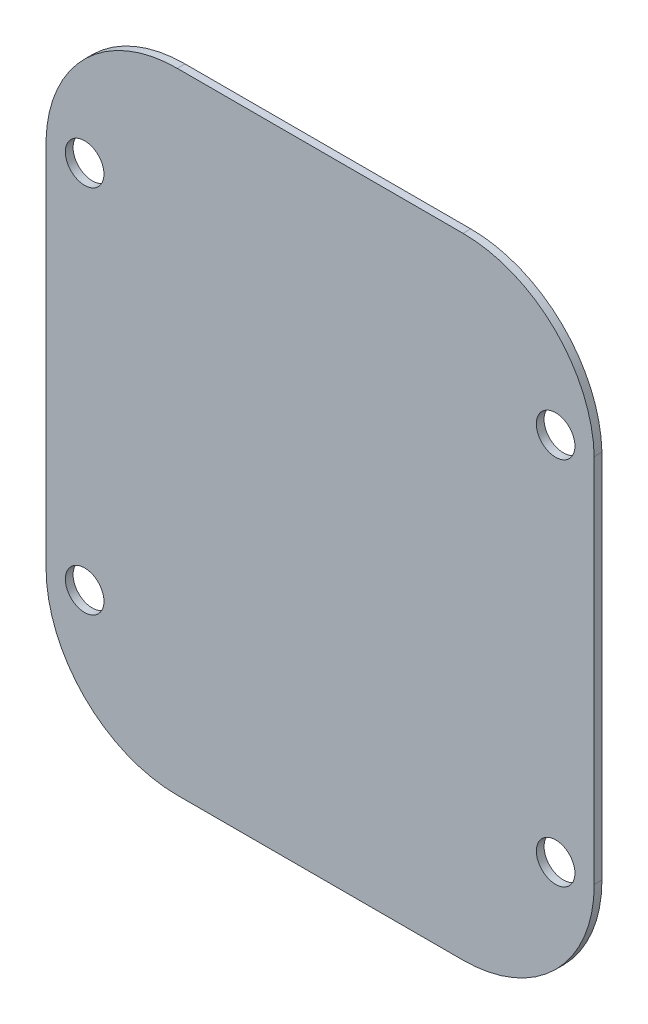
ISO-10303-21;
HEADER;
FILE_DESCRIPTION(('STEP AP214'),'2;1');
FILE_NAME('part.step','',(''),(''),'','','');
FILE_SCHEMA(('AUTOMOTIVE_DESIGN { 1 0 10303 214 1 1 1 1 }'));
ENDSEC;
DATA;
#1=APPLICATION_CONTEXT('core data for automotive mechanical design processes');
#2=APPLICATION_PROTOCOL_DEFINITION('international standard','automotive_design',2000,#1);
#3=PRODUCT_CONTEXT('',#1,'mechanical');
#4=PRODUCT('Part','Part','',(#3));
#5=PRODUCT_RELATED_PRODUCT_CATEGORY('part','',(#4));
#6=PRODUCT_DEFINITION_FORMATION('','',#4);
#7=PRODUCT_DEFINITION_CONTEXT('part definition',#1,'design');
#8=PRODUCT_DEFINITION('design','',#6,#7);
#9=PRODUCT_DEFINITION_SHAPE('','',#8);
#10=(LENGTH_UNIT() NAMED_UNIT(*) SI_UNIT(.MILLI.,.METRE.));
#11=(NAMED_UNIT(*) PLANE_ANGLE_UNIT() SI_UNIT($,.RADIAN.));
#12=(NAMED_UNIT(*) SI_UNIT($,.STERADIAN.) SOLID_ANGLE_UNIT());
#13=UNCERTAINTY_MEASURE_WITH_UNIT(LENGTH_MEASURE(1.E-05),#10,'distance_accuracy_value','');
#14=(GEOMETRIC_REPRESENTATION_CONTEXT(3) GLOBAL_UNCERTAINTY_ASSIGNED_CONTEXT((#13)) GLOBAL_UNIT_ASSIGNED_CONTEXT((#10,
#11,#12)) REPRESENTATION_CONTEXT('',''));
#15=CARTESIAN_POINT('',(0.,0.,0.));
#16=DIRECTION('',(0.,0.,1.));
#17=DIRECTION('',(1.,0.,0.));
#18=AXIS2_PLACEMENT_3D('',#15,#16,#17);
#19=CARTESIAN_POINT('',(92.5899601509382,118.898474184003,5.));
#20=DIRECTION('',(0.,0.,-1.));
#21=DIRECTION('',(-1.,0.,0.));
#22=AXIS2_PLACEMENT_3D('',#19,#20,#21);
#23=CYLINDRICAL_SURFACE('',#22,85.);
#24=CARTESIAN_POINT('',(92.5899601509382,118.898474184003,0.));
#25=DIRECTION('',(0.,0.,1.));
#26=DIRECTION('',(1.,0.,0.));
#27=AXIS2_PLACEMENT_3D('',#24,#25,#26);
#28=CIRCLE('',#27,85.);
#29=CARTESIAN_POINT('',(177.561405603949,121.101530612245,0.));
#30=VERTEX_POINT('',#29);
#31=CARTESIAN_POINT('',(92.561405603949,203.898469387755,0.));
#32=VERTEX_POINT('',#31);
#33=EDGE_CURVE('E128',#30,#32,#28,.T.);
#34=ORIENTED_EDGE('',*,*,#33,.T.);
#35=DIRECTION('',(0.,0.,-1.));
#36=VECTOR('',#35,1.);
#37=CARTESIAN_POINT('',(92.561405603949,203.898469387755,5.));
#38=LINE('',#37,#36);
#39=CARTESIAN_POINT('',(92.561405603949,203.898469387755,5.));
#40=VERTEX_POINT('',#39);
#41=EDGE_CURVE('E11',#40,#32,#38,.T.);
#42=ORIENTED_EDGE('',*,*,#41,.F.);
#43=CARTESIAN_POINT('',(92.5899601509382,118.898474184003,5.));
#44=DIRECTION('',(0.,0.,1.));
#45=DIRECTION('',(1.,0.,0.));
#46=AXIS2_PLACEMENT_3D('',#43,#44,#45);
#47=CIRCLE('',#46,85.);
#48=CARTESIAN_POINT('',(177.561405603949,121.101530612245,5.));
#49=VERTEX_POINT('',#48);
#50=EDGE_CURVE('E143',#49,#40,#47,.T.);
#51=ORIENTED_EDGE('',*,*,#50,.F.);
#52=DIRECTION('',(0.,0.,-1.));
#53=VECTOR('',#52,1.);
#54=CARTESIAN_POINT('',(177.561405603949,121.101530612245,5.));
#55=LINE('',#54,#53);
#56=EDGE_CURVE('E124',#49,#30,#55,.T.);
#57=ORIENTED_EDGE('',*,*,#56,.T.);
#58=EDGE_LOOP('',(#34,#42,#51,#57));
#59=FACE_BOUND('',#58,.T.);
#60=ADVANCED_FACE('F32',(#59),#23,.T.);
#61=CARTESIAN_POINT('',(92.561405603949,203.898469387755,5.));
#62=DIRECTION('',(0.,-1.,0.));
#63=DIRECTION('',(1.,0.,0.));
#64=AXIS2_PLACEMENT_3D('',#61,#62,#63);
#65=PLANE('',#64);
#66=DIRECTION('',(-1.,0.,0.));
#67=VECTOR('',#66,1.);
#68=CARTESIAN_POINT('',(92.561405603949,203.898469387755,0.));
#69=LINE('',#68,#67);
#70=CARTESIAN_POINT('',(-92.5614056039489,203.898469387755,0.));
#71=VERTEX_POINT('',#70);
#72=EDGE_CURVE('E131',#32,#71,#69,.T.);
#73=ORIENTED_EDGE('',*,*,#72,.T.);
#74=DIRECTION('',(0.,0.,-1.));
#75=VECTOR('',#74,1.);
#76=CARTESIAN_POINT('',(-92.5614056039489,203.898469387755,5.));
#77=LINE('',#76,#75);
#78=CARTESIAN_POINT('',(-92.5614056039489,203.898469387755,5.));
#79=VERTEX_POINT('',#78);
#80=EDGE_CURVE('E40',#79,#71,#77,.T.);
#81=ORIENTED_EDGE('',*,*,#80,.F.);
#82=DIRECTION('',(-1.,0.,0.));
#83=VECTOR('',#82,1.);
#84=CARTESIAN_POINT('',(92.561405603949,203.898469387755,5.));
#85=LINE('',#84,#83);
#86=EDGE_CURVE('E91',#40,#79,#85,.T.);
#87=ORIENTED_EDGE('',*,*,#86,.F.);
#88=ORIENTED_EDGE('',*,*,#41,.T.);
#89=EDGE_LOOP('',(#73,#81,#87,#88));
#90=FACE_BOUND('',#89,.T.);
#91=ADVANCED_FACE('F225',(#90),#65,.F.);
#92=CARTESIAN_POINT('',(-92.589960150938,118.898474184003,5.));
#93=DIRECTION('',(0.,0.,-1.));
#94=DIRECTION('',(-1.,0.,0.));
#95=AXIS2_PLACEMENT_3D('',#92,#93,#94);
#96=CYLINDRICAL_SURFACE('',#95,85.0000000000001);
#97=CARTESIAN_POINT('',(-92.589960150938,118.898474184003,0.));
#98=DIRECTION('',(0.,0.,1.));
#99=DIRECTION('',(1.,0.,0.));
#100=AXIS2_PLACEMENT_3D('',#97,#98,#99);
#101=CIRCLE('',#100,85.0000000000001);
#102=CARTESIAN_POINT('',(-177.561405603949,121.101530612245,0.));
#103=VERTEX_POINT('',#102);
#104=EDGE_CURVE('E134',#71,#103,#101,.T.);
#105=ORIENTED_EDGE('',*,*,#104,.T.);
#106=DIRECTION('',(0.,0.,-1.));
#107=VECTOR('',#106,1.);
#108=CARTESIAN_POINT('',(-177.561405603949,121.101530612245,5.));
#109=LINE('',#108,#107);
#110=CARTESIAN_POINT('',(-177.561405603949,121.101530612245,5.));
#111=VERTEX_POINT('',#110);
#112=EDGE_CURVE('E150',#111,#103,#109,.T.);
#113=ORIENTED_EDGE('',*,*,#112,.F.);
#114=CARTESIAN_POINT('',(-92.589960150938,118.898474184003,5.));
#115=DIRECTION('',(0.,0.,1.));
#116=DIRECTION('',(1.,0.,0.));
#117=AXIS2_PLACEMENT_3D('',#114,#115,#116);
#118=CIRCLE('',#117,85.0000000000001);
#119=EDGE_CURVE('E158',#79,#111,#118,.T.);
#120=ORIENTED_EDGE('',*,*,#119,.F.);
#121=ORIENTED_EDGE('',*,*,#80,.T.);
#122=EDGE_LOOP('',(#105,#113,#120,#121));
#123=FACE_BOUND('',#122,.T.);
#124=ADVANCED_FACE('F156',(#123),#96,.T.);
#125=CARTESIAN_POINT('',(-177.561405603949,121.101530612245,5.));
#126=DIRECTION('',(1.,0.,0.));
#127=DIRECTION('',(0.,1.,0.));
#128=AXIS2_PLACEMENT_3D('',#125,#126,#127);
#129=PLANE('',#128);
#130=DIRECTION('',(0.,-1.,0.));
#131=VECTOR('',#130,1.);
#132=CARTESIAN_POINT('',(-177.561405603949,121.101530612245,0.));
#133=LINE('',#132,#131);
#134=CARTESIAN_POINT('',(-177.561405603949,-118.898469387755,0.));
#135=VERTEX_POINT('',#134);
#136=EDGE_CURVE('E136',#103,#135,#133,.T.);
#137=ORIENTED_EDGE('',*,*,#136,.T.);
#138=DIRECTION('',(0.,0.,-1.));
#139=VECTOR('',#138,1.);
#140=CARTESIAN_POINT('',(-177.561405603949,-118.898469387755,5.));
#141=LINE('',#140,#139);
#142=CARTESIAN_POINT('',(-177.561405603949,-118.898469387755,5.));
#143=VERTEX_POINT('',#142);
#144=EDGE_CURVE('E147',#143,#135,#141,.T.);
#145=ORIENTED_EDGE('',*,*,#144,.F.);
#146=DIRECTION('',(0.,-1.,0.));
#147=VECTOR('',#146,1.);
#148=CARTESIAN_POINT('',(-177.561405603949,121.101530612245,5.));
#149=LINE('',#148,#147);
#150=EDGE_CURVE('E170',#111,#143,#149,.T.);
#151=ORIENTED_EDGE('',*,*,#150,.F.);
#152=ORIENTED_EDGE('',*,*,#112,.T.);
#153=EDGE_LOOP('',(#137,#145,#151,#152));
#154=FACE_BOUND('',#153,.T.);
#155=ADVANCED_FACE('F166',(#154),#129,.F.);
#156=CARTESIAN_POINT('',(-92.5614056039489,-118.898469387755,5.));
#157=DIRECTION('',(0.,0.,-1.));
#158=DIRECTION('',(-1.,0.,0.));
#159=AXIS2_PLACEMENT_3D('',#156,#157,#158);
#160=CYLINDRICAL_SURFACE('',#159,85.);
#161=CARTESIAN_POINT('',(-92.5614056039489,-118.898469387755,0.));
#162=DIRECTION('',(0.,0.,1.));
#163=DIRECTION('',(1.,0.,0.));
#164=AXIS2_PLACEMENT_3D('',#161,#162,#163);
#165=CIRCLE('',#164,85.);
#166=CARTESIAN_POINT('',(-92.5614056039489,-203.898469387755,0.));
#167=VERTEX_POINT('',#166);
#168=EDGE_CURVE('E138',#135,#167,#165,.T.);
#169=ORIENTED_EDGE('',*,*,#168,.T.);
#170=DIRECTION('',(0.,0.,-1.));
#171=VECTOR('',#170,1.);
#172=CARTESIAN_POINT('',(-92.5614056039489,-203.898469387755,5.));
#173=LINE('',#172,#171);
#174=CARTESIAN_POINT('',(-92.5614056039489,-203.898469387755,5.));
#175=VERTEX_POINT('',#174);
#176=EDGE_CURVE('E119',#175,#167,#173,.T.);
#177=ORIENTED_EDGE('',*,*,#176,.F.);
#178=CARTESIAN_POINT('',(-92.5614056039489,-118.898469387755,5.));
#179=DIRECTION('',(0.,0.,1.));
#180=DIRECTION('',(1.,0.,0.));
#181=AXIS2_PLACEMENT_3D('',#178,#179,#180);
#182=CIRCLE('',#181,85.);
#183=EDGE_CURVE('E110',#143,#175,#182,.T.);
#184=ORIENTED_EDGE('',*,*,#183,.F.);
#185=ORIENTED_EDGE('',*,*,#144,.T.);
#186=EDGE_LOOP('',(#169,#177,#184,#185));
#187=FACE_BOUND('',#186,.T.);
#188=ADVANCED_FACE('F169',(#187),#160,.T.);
#189=CARTESIAN_POINT('',(-92.5614056039489,-203.898469387755,5.));
#190=DIRECTION('',(0.,1.,0.));
#191=DIRECTION('',(-1.,0.,0.));
#192=AXIS2_PLACEMENT_3D('',#189,#190,#191);
#193=PLANE('',#192);
#194=DIRECTION('',(1.,0.,0.));
#195=VECTOR('',#194,1.);
#196=CARTESIAN_POINT('',(-92.5614056039489,-203.898469387755,0.));
#197=LINE('',#196,#195);
#198=CARTESIAN_POINT('',(92.561405603949,-203.898469387755,0.));
#199=VERTEX_POINT('',#198);
#200=EDGE_CURVE('E118',#167,#199,#197,.T.);
#201=ORIENTED_EDGE('',*,*,#200,.T.);
#202=DIRECTION('',(0.,0.,-1.));
#203=VECTOR('',#202,1.);
#204=CARTESIAN_POINT('',(92.561405603949,-203.898469387755,5.));
#205=LINE('',#204,#203);
#206=CARTESIAN_POINT('',(92.561405603949,-203.898469387755,5.));
#207=VERTEX_POINT('',#206);
#208=EDGE_CURVE('E115',#207,#199,#205,.T.);
#209=ORIENTED_EDGE('',*,*,#208,.F.);
#210=DIRECTION('',(1.,0.,0.));
#211=VECTOR('',#210,1.);
#212=CARTESIAN_POINT('',(-92.5614056039489,-203.898469387755,5.));
#213=LINE('',#212,#211);
#214=EDGE_CURVE('E104',#175,#207,#213,.T.);
#215=ORIENTED_EDGE('',*,*,#214,.F.);
#216=ORIENTED_EDGE('',*,*,#176,.T.);
#217=EDGE_LOOP('',(#201,#209,#215,#216));
#218=FACE_BOUND('',#217,.T.);
#219=ADVANCED_FACE('F116',(#218),#193,.F.);
#220=CARTESIAN_POINT('',(92.561405603949,-118.898469387755,5.));
#221=DIRECTION('',(0.,0.,-1.));
#222=DIRECTION('',(-1.,0.,0.));
#223=AXIS2_PLACEMENT_3D('',#220,#221,#222);
#224=CYLINDRICAL_SURFACE('',#223,85.);
#225=CARTESIAN_POINT('',(92.561405603949,-118.898469387755,0.));
#226=DIRECTION('',(0.,0.,1.));
#227=DIRECTION('',(1.,0.,0.));
#228=AXIS2_PLACEMENT_3D('',#225,#226,#227);
#229=CIRCLE('',#228,85.);
#230=CARTESIAN_POINT('',(177.561405603949,-118.898469387755,0.));
#231=VERTEX_POINT('',#230);
#232=EDGE_CURVE('E77',#199,#231,#229,.T.);
#233=ORIENTED_EDGE('',*,*,#232,.T.);
#234=DIRECTION('',(0.,0.,-1.));
#235=VECTOR('',#234,1.);
#236=CARTESIAN_POINT('',(177.561405603949,-118.898469387755,5.));
#237=LINE('',#236,#235);
#238=CARTESIAN_POINT('',(177.561405603949,-118.898469387755,5.));
#239=VERTEX_POINT('',#238);
#240=EDGE_CURVE('E120',#239,#231,#237,.T.);
#241=ORIENTED_EDGE('',*,*,#240,.F.);
#242=CARTESIAN_POINT('',(92.561405603949,-118.898469387755,5.));
#243=DIRECTION('',(0.,0.,1.));
#244=DIRECTION('',(1.,0.,0.));
#245=AXIS2_PLACEMENT_3D('',#242,#243,#244);
#246=CIRCLE('',#245,85.);
#247=EDGE_CURVE('E108',#207,#239,#246,.T.);
#248=ORIENTED_EDGE('',*,*,#247,.F.);
#249=ORIENTED_EDGE('',*,*,#208,.T.);
#250=EDGE_LOOP('',(#233,#241,#248,#249));
#251=FACE_BOUND('',#250,.T.);
#252=ADVANCED_FACE('F122',(#251),#224,.T.);
#253=CARTESIAN_POINT('',(177.561405603949,-118.898469387755,5.));
#254=DIRECTION('',(-1.,0.,0.));
#255=DIRECTION('',(0.,0.,1.));
#256=AXIS2_PLACEMENT_3D('',#253,#254,#255);
#257=PLANE('',#256);
#258=DIRECTION('',(0.,1.,0.));
#259=VECTOR('',#258,1.);
#260=CARTESIAN_POINT('',(177.561405603949,-118.898469387755,0.));
#261=LINE('',#260,#259);
#262=EDGE_CURVE('E83',#231,#30,#261,.T.);
#263=ORIENTED_EDGE('',*,*,#262,.T.);
#264=ORIENTED_EDGE('',*,*,#56,.F.);
#265=DIRECTION('',(0.,1.,0.));
#266=VECTOR('',#265,1.);
#267=CARTESIAN_POINT('',(177.561405603949,-118.898469387755,5.));
#268=LINE('',#267,#266);
#269=EDGE_CURVE('E48',#239,#49,#268,.T.);
#270=ORIENTED_EDGE('',*,*,#269,.F.);
#271=ORIENTED_EDGE('',*,*,#240,.T.);
#272=EDGE_LOOP('',(#263,#264,#270,#271));
#273=FACE_BOUND('',#272,.T.);
#274=ADVANCED_FACE('F204',(#273),#257,.F.);
#275=CARTESIAN_POINT('',(92.5899601509382,118.898474184003,5.));
#276=DIRECTION('',(0.,0.,1.));
#277=DIRECTION('',(1.,0.,0.));
#278=AXIS2_PLACEMENT_3D('',#275,#276,#277);
#279=PLANE('',#278);
#280=CARTESIAN_POINT('',(152.561405603949,120.749347025815,5.));
#281=DIRECTION('',(0.,0.,1.));
#282=DIRECTION('',(1.,0.,0.));
#283=AXIS2_PLACEMENT_3D('',#280,#281,#282);
#284=CIRCLE('',#283,12.5);
#285=CARTESIAN_POINT('',(165.061405603949,120.749347025815,5.));
#286=VERTEX_POINT('',#285);
#287=EDGE_CURVE('E179',#286,#286,#284,.T.);
#288=ORIENTED_EDGE('',*,*,#287,.F.);
#289=EDGE_LOOP('',(#288));
#290=FACE_BOUND('',#289,.T.);
#291=CARTESIAN_POINT('',(-152.561405603949,-118.898469387755,5.));
#292=DIRECTION('',(0.,0.,1.));
#293=DIRECTION('',(1.,0.,0.));
#294=AXIS2_PLACEMENT_3D('',#291,#292,#293);
#295=CIRCLE('',#294,12.5);
#296=CARTESIAN_POINT('',(-140.061405603949,-118.898469387755,5.));
#297=VERTEX_POINT('',#296);
#298=EDGE_CURVE('E185',#297,#297,#295,.T.);
#299=ORIENTED_EDGE('',*,*,#298,.F.);
#300=EDGE_LOOP('',(#299));
#301=FACE_BOUND('',#300,.T.);
#302=CARTESIAN_POINT('',(152.561405603949,-118.898469387755,5.));
#303=DIRECTION('',(0.,0.,1.));
#304=DIRECTION('',(1.,0.,0.));
#305=AXIS2_PLACEMENT_3D('',#302,#303,#304);
#306=CIRCLE('',#305,12.5);
#307=CARTESIAN_POINT('',(165.061405603949,-118.898469387755,5.));
#308=VERTEX_POINT('',#307);
#309=EDGE_CURVE('E186',#308,#308,#306,.T.);
#310=ORIENTED_EDGE('',*,*,#309,.F.);
#311=EDGE_LOOP('',(#310));
#312=FACE_BOUND('',#311,.T.);
#313=CARTESIAN_POINT('',(-152.561405603949,120.749347025814,5.));
#314=DIRECTION('',(0.,0.,1.));
#315=DIRECTION('',(1.,0.,0.));
#316=AXIS2_PLACEMENT_3D('',#313,#314,#315);
#317=CIRCLE('',#316,12.5);
#318=CARTESIAN_POINT('',(-140.061405603949,120.749347025814,5.));
#319=VERTEX_POINT('',#318);
#320=EDGE_CURVE('E176',#319,#319,#317,.T.);
#321=ORIENTED_EDGE('',*,*,#320,.F.);
#322=EDGE_LOOP('',(#321));
#323=FACE_BOUND('',#322,.T.);
#324=ORIENTED_EDGE('',*,*,#50,.T.);
#325=ORIENTED_EDGE('',*,*,#86,.T.);
#326=ORIENTED_EDGE('',*,*,#119,.T.);
#327=ORIENTED_EDGE('',*,*,#150,.T.);
#328=ORIENTED_EDGE('',*,*,#183,.T.);
#329=ORIENTED_EDGE('',*,*,#214,.T.);
#330=ORIENTED_EDGE('',*,*,#247,.T.);
#331=ORIENTED_EDGE('',*,*,#269,.T.);
#332=EDGE_LOOP('',(#324,#325,#326,#327,#328,#329,#330,#331));
#333=FACE_BOUND('',#332,.T.);
#334=ADVANCED_FACE('F106',(#290,#301,#312,#323,#333),#279,.T.);
#335=CARTESIAN_POINT('',(92.5899601509382,118.898474184003,0.));
#336=DIRECTION('',(0.,0.,1.));
#337=DIRECTION('',(1.,0.,0.));
#338=AXIS2_PLACEMENT_3D('',#335,#336,#337);
#339=PLANE('',#338);
#340=CARTESIAN_POINT('',(152.561405603949,120.749347025815,0.));
#341=DIRECTION('',(0.,0.,1.));
#342=DIRECTION('',(1.,0.,0.));
#343=AXIS2_PLACEMENT_3D('',#340,#341,#342);
#344=CIRCLE('',#343,12.5);
#345=CARTESIAN_POINT('',(165.061405603949,120.749347025815,0.));
#346=VERTEX_POINT('',#345);
#347=EDGE_CURVE('E189',#346,#346,#344,.T.);
#348=ORIENTED_EDGE('',*,*,#347,.T.);
#349=EDGE_LOOP('',(#348));
#350=FACE_BOUND('',#349,.T.);
#351=CARTESIAN_POINT('',(-152.561405603949,-118.898469387755,0.));
#352=DIRECTION('',(0.,0.,1.));
#353=DIRECTION('',(1.,0.,0.));
#354=AXIS2_PLACEMENT_3D('',#351,#352,#353);
#355=CIRCLE('',#354,12.5);
#356=CARTESIAN_POINT('',(-140.061405603949,-118.898469387755,0.));
#357=VERTEX_POINT('',#356);
#358=EDGE_CURVE('E182',#357,#357,#355,.T.);
#359=ORIENTED_EDGE('',*,*,#358,.T.);
#360=EDGE_LOOP('',(#359));
#361=FACE_BOUND('',#360,.T.);
#362=CARTESIAN_POINT('',(152.561405603949,-118.898469387755,0.));
#363=DIRECTION('',(0.,0.,1.));
#364=DIRECTION('',(1.,0.,0.));
#365=AXIS2_PLACEMENT_3D('',#362,#363,#364);
#366=CIRCLE('',#365,12.5);
#367=CARTESIAN_POINT('',(165.061405603949,-118.898469387755,0.));
#368=VERTEX_POINT('',#367);
#369=EDGE_CURVE('E194',#368,#368,#366,.T.);
#370=ORIENTED_EDGE('',*,*,#369,.T.);
#371=EDGE_LOOP('',(#370));
#372=FACE_BOUND('',#371,.T.);
#373=CARTESIAN_POINT('',(-152.561405603949,120.749347025814,0.));
#374=DIRECTION('',(0.,0.,1.));
#375=DIRECTION('',(1.,0.,0.));
#376=AXIS2_PLACEMENT_3D('',#373,#374,#375);
#377=CIRCLE('',#376,12.5);
#378=CARTESIAN_POINT('',(-140.061405603949,120.749347025814,0.));
#379=VERTEX_POINT('',#378);
#380=EDGE_CURVE('E132',#379,#379,#377,.T.);
#381=ORIENTED_EDGE('',*,*,#380,.T.);
#382=EDGE_LOOP('',(#381));
#383=FACE_BOUND('',#382,.T.);
#384=ORIENTED_EDGE('',*,*,#33,.F.);
#385=ORIENTED_EDGE('',*,*,#262,.F.);
#386=ORIENTED_EDGE('',*,*,#232,.F.);
#387=ORIENTED_EDGE('',*,*,#200,.F.);
#388=ORIENTED_EDGE('',*,*,#168,.F.);
#389=ORIENTED_EDGE('',*,*,#136,.F.);
#390=ORIENTED_EDGE('',*,*,#104,.F.);
#391=ORIENTED_EDGE('',*,*,#72,.F.);
#392=EDGE_LOOP('',(#384,#385,#386,#387,#388,#389,#390,#391));
#393=FACE_BOUND('',#392,.T.);
#394=ADVANCED_FACE('F162',(#350,#361,#372,#383,#393),#339,.F.);
#395=CARTESIAN_POINT('',(-152.561405603949,120.749347025814,0.));
#396=DIRECTION('',(0.,0.,1.));
#397=DIRECTION('',(1.,0.,0.));
#398=AXIS2_PLACEMENT_3D('',#395,#396,#397);
#399=CYLINDRICAL_SURFACE('',#398,12.5);
#400=ORIENTED_EDGE('',*,*,#380,.F.);
#401=EDGE_LOOP('',(#400));
#402=FACE_BOUND('',#401,.T.);
#403=ORIENTED_EDGE('',*,*,#320,.T.);
#404=EDGE_LOOP('',(#403));
#405=FACE_BOUND('',#404,.T.);
#406=ADVANCED_FACE('F209',(#402,#405),#399,.F.);
#407=CARTESIAN_POINT('',(152.561405603949,-118.898469387755,0.));
#408=DIRECTION('',(0.,0.,1.));
#409=DIRECTION('',(1.,0.,0.));
#410=AXIS2_PLACEMENT_3D('',#407,#408,#409);
#411=CYLINDRICAL_SURFACE('',#410,12.5);
#412=ORIENTED_EDGE('',*,*,#369,.F.);
#413=EDGE_LOOP('',(#412));
#414=FACE_BOUND('',#413,.T.);
#415=ORIENTED_EDGE('',*,*,#309,.T.);
#416=EDGE_LOOP('',(#415));
#417=FACE_BOUND('',#416,.T.);
#418=ADVANCED_FACE('F200',(#414,#417),#411,.F.);
#419=CARTESIAN_POINT('',(-152.561405603949,-118.898469387755,0.));
#420=DIRECTION('',(0.,0.,1.));
#421=DIRECTION('',(1.,0.,0.));
#422=AXIS2_PLACEMENT_3D('',#419,#420,#421);
#423=CYLINDRICAL_SURFACE('',#422,12.5);
#424=ORIENTED_EDGE('',*,*,#358,.F.);
#425=EDGE_LOOP('',(#424));
#426=FACE_BOUND('',#425,.T.);
#427=ORIENTED_EDGE('',*,*,#298,.T.);
#428=EDGE_LOOP('',(#427));
#429=FACE_BOUND('',#428,.T.);
#430=ADVANCED_FACE('F217',(#426,#429),#423,.F.);
#431=CARTESIAN_POINT('',(152.561405603949,120.749347025815,0.));
#432=DIRECTION('',(0.,0.,1.));
#433=DIRECTION('',(1.,0.,0.));
#434=AXIS2_PLACEMENT_3D('',#431,#432,#433);
#435=CYLINDRICAL_SURFACE('',#434,12.5);
#436=ORIENTED_EDGE('',*,*,#347,.F.);
#437=EDGE_LOOP('',(#436));
#438=FACE_BOUND('',#437,.T.);
#439=ORIENTED_EDGE('',*,*,#287,.T.);
#440=EDGE_LOOP('',(#439));
#441=FACE_BOUND('',#440,.T.);
#442=ADVANCED_FACE('F301',(#438,#441),#435,.F.);
#443=CLOSED_SHELL('',(#60,#91,#124,#155,#188,#219,#252,#274,#334,#394,#406,#418,#430,#442));
#444=MANIFOLD_SOLID_BREP('B2',#443);
#445=ADVANCED_BREP_SHAPE_REPRESENTATION('',(#18,#444),#14);
#446=SHAPE_DEFINITION_REPRESENTATION(#9,#445);
ENDSEC;
END-ISO-10303-21;
